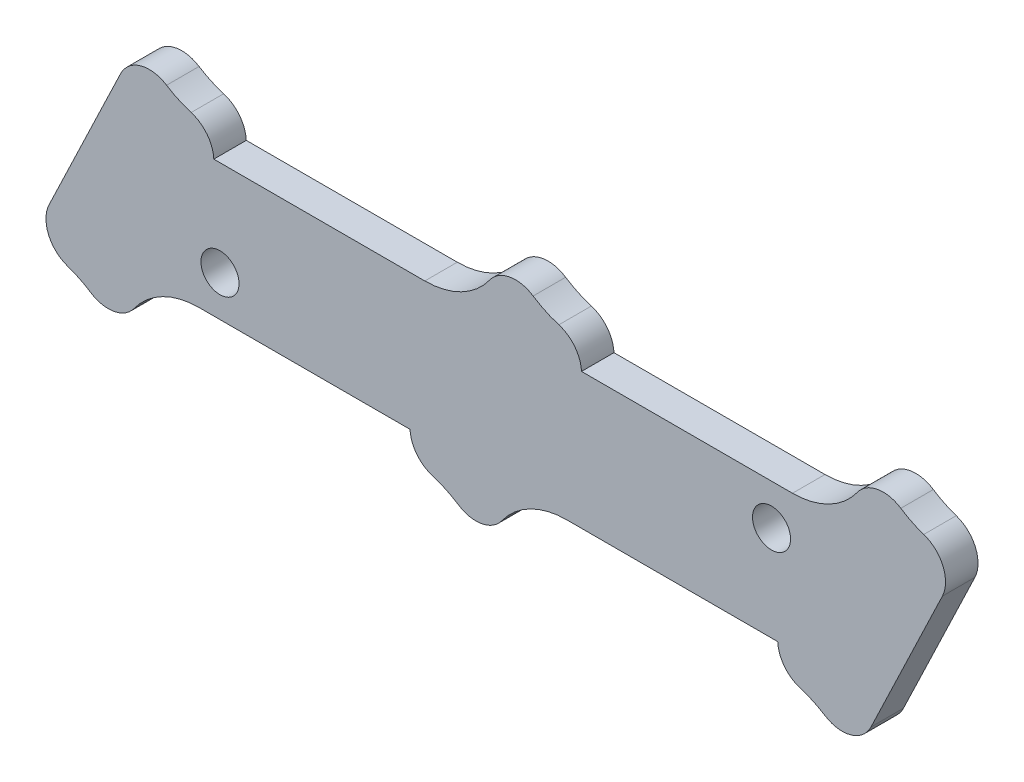
ISO-10303-21;
HEADER;
FILE_DESCRIPTION(('STEP AP214'),'2;1');
FILE_NAME('part.step','',(''),(''),'','','');
FILE_SCHEMA(('AUTOMOTIVE_DESIGN { 1 0 10303 214 1 1 1 1 }'));
ENDSEC;
DATA;
#1=APPLICATION_CONTEXT('core data for automotive mechanical design processes');
#2=APPLICATION_PROTOCOL_DEFINITION('international standard','automotive_design',2000,#1);
#3=PRODUCT_CONTEXT('',#1,'mechanical');
#4=PRODUCT('Part','Part','',(#3));
#5=PRODUCT_RELATED_PRODUCT_CATEGORY('part','',(#4));
#6=PRODUCT_DEFINITION_FORMATION('','',#4);
#7=PRODUCT_DEFINITION_CONTEXT('part definition',#1,'design');
#8=PRODUCT_DEFINITION('design','',#6,#7);
#9=PRODUCT_DEFINITION_SHAPE('','',#8);
#10=(LENGTH_UNIT() NAMED_UNIT(*) SI_UNIT(.MILLI.,.METRE.));
#11=(NAMED_UNIT(*) PLANE_ANGLE_UNIT() SI_UNIT($,.RADIAN.));
#12=(NAMED_UNIT(*) SI_UNIT($,.STERADIAN.) SOLID_ANGLE_UNIT());
#13=UNCERTAINTY_MEASURE_WITH_UNIT(LENGTH_MEASURE(1.E-05),#10,'distance_accuracy_value','');
#14=(GEOMETRIC_REPRESENTATION_CONTEXT(3) GLOBAL_UNCERTAINTY_ASSIGNED_CONTEXT((#13)) GLOBAL_UNIT_ASSIGNED_CONTEXT((#10,
#11,#12)) REPRESENTATION_CONTEXT('',''));
#15=CARTESIAN_POINT('',(0.,0.,0.));
#16=DIRECTION('',(0.,0.,1.));
#17=DIRECTION('',(1.,0.,0.));
#18=AXIS2_PLACEMENT_3D('',#15,#16,#17);
#19=CARTESIAN_POINT('',(10.775,10.775,2.032));
#20=DIRECTION('',(0.,0.,-1.));
#21=DIRECTION('',(-1.,0.,0.));
#22=AXIS2_PLACEMENT_3D('',#19,#20,#21);
#23=CYLINDRICAL_SURFACE('',#22,6.2);
#24=CARTESIAN_POINT('',(10.775,10.775,0.));
#25=DIRECTION('',(0.,0.,1.));
#26=DIRECTION('',(1.,0.,0.));
#27=AXIS2_PLACEMENT_3D('',#24,#25,#26);
#28=CIRCLE('',#27,6.2);
#29=CARTESIAN_POINT('',(14.1869891683855,15.9517103371562,0.));
#30=VERTEX_POINT('',#29);
#31=CARTESIAN_POINT('',(12.7522873345002,16.6512517642478,0.));
#32=VERTEX_POINT('',#31);
#33=EDGE_CURVE('E631',#30,#32,#28,.T.);
#34=ORIENTED_EDGE('',*,*,#33,.F.);
#35=DIRECTION('',(0.,0.,-1.));
#36=VECTOR('',#35,1.);
#37=CARTESIAN_POINT('',(14.1869891683855,15.9517103371562,2.032));
#38=LINE('',#37,#36);
#39=CARTESIAN_POINT('',(14.1869891683855,15.9517103371562,2.032));
#40=VERTEX_POINT('',#39);
#41=EDGE_CURVE('E306',#30,#40,#38,.F.);
#42=ORIENTED_EDGE('',*,*,#41,.T.);
#43=CARTESIAN_POINT('',(10.775,10.775,2.032));
#44=DIRECTION('',(0.,0.,1.));
#45=DIRECTION('',(1.,0.,0.));
#46=AXIS2_PLACEMENT_3D('',#43,#44,#45);
#47=CIRCLE('',#46,6.2);
#48=CARTESIAN_POINT('',(12.7522873345002,16.6512517642478,2.032));
#49=VERTEX_POINT('',#48);
#50=EDGE_CURVE('E244',#40,#49,#47,.T.);
#51=ORIENTED_EDGE('',*,*,#50,.T.);
#52=DIRECTION('',(0.,0.,-1.));
#53=VECTOR('',#52,1.);
#54=CARTESIAN_POINT('',(12.7522873345002,16.6512517642478,2.032));
#55=LINE('',#54,#53);
#56=EDGE_CURVE('E303',#49,#32,#55,.T.);
#57=ORIENTED_EDGE('',*,*,#56,.T.);
#58=EDGE_LOOP('',(#34,#42,#51,#57));
#59=FACE_BOUND('',#58,.T.);
#60=ADVANCED_FACE('F45',(#59),#23,.F.);
#61=CARTESIAN_POINT('',(0.,18.525,2.032));
#62=DIRECTION('',(0.,1.,0.));
#63=DIRECTION('',(0.,0.,1.));
#64=AXIS2_PLACEMENT_3D('',#61,#62,#63);
#65=PLANE('',#64);
#66=DIRECTION('',(1.,0.,0.));
#67=VECTOR('',#66,1.);
#68=CARTESIAN_POINT('',(0.,18.525,2.032));
#69=LINE('',#68,#67);
#70=CARTESIAN_POINT('',(20.9636972547808,18.525,2.032));
#71=VERTEX_POINT('',#70);
#72=CARTESIAN_POINT('',(34.1619208211239,18.525,2.032));
#73=VERTEX_POINT('',#72);
#74=EDGE_CURVE('E230',#71,#73,#69,.T.);
#75=ORIENTED_EDGE('',*,*,#74,.F.);
#76=DIRECTION('',(0.,0.,-1.));
#77=VECTOR('',#76,1.);
#78=CARTESIAN_POINT('',(20.9636972547808,18.525,0.));
#79=LINE('',#78,#77);
#80=CARTESIAN_POINT('',(20.9636972547808,18.525,0.));
#81=VERTEX_POINT('',#80);
#82=EDGE_CURVE('E345',#71,#81,#79,.T.);
#83=ORIENTED_EDGE('',*,*,#82,.T.);
#84=DIRECTION('',(1.,0.,0.));
#85=VECTOR('',#84,1.);
#86=CARTESIAN_POINT('',(0.,18.525,0.));
#87=LINE('',#86,#85);
#88=CARTESIAN_POINT('',(34.1619208211239,18.525,0.));
#89=VERTEX_POINT('',#88);
#90=EDGE_CURVE('E251',#81,#89,#87,.T.);
#91=ORIENTED_EDGE('',*,*,#90,.T.);
#92=DIRECTION('',(0.,0.,-1.));
#93=VECTOR('',#92,1.);
#94=CARTESIAN_POINT('',(34.1619208211239,18.525,2.032));
#95=LINE('',#94,#93);
#96=EDGE_CURVE('E248',#73,#89,#95,.T.);
#97=ORIENTED_EDGE('',*,*,#96,.F.);
#98=EDGE_LOOP('',(#75,#83,#91,#97));
#99=FACE_BOUND('',#98,.T.);
#100=ADVANCED_FACE('F249',(#99),#65,.F.);
#101=CARTESIAN_POINT('',(33.775,10.775,2.032));
#102=DIRECTION('',(0.,0.,-1.));
#103=DIRECTION('',(-1.,0.,0.));
#104=AXIS2_PLACEMENT_3D('',#101,#102,#103);
#105=CYLINDRICAL_SURFACE('',#104,6.2);
#106=CARTESIAN_POINT('',(33.775,10.775,2.032));
#107=DIRECTION('',(0.,0.,1.));
#108=DIRECTION('',(1.,0.,0.));
#109=AXIS2_PLACEMENT_3D('',#106,#107,#108);
#110=CIRCLE('',#109,6.2);
#111=CARTESIAN_POINT('',(37.1869891683854,15.9517103371562,2.032));
#112=VERTEX_POINT('',#111);
#113=CARTESIAN_POINT('',(35.5780162784352,16.7070428437173,2.032));
#114=VERTEX_POINT('',#113);
#115=EDGE_CURVE('E243',#112,#114,#110,.T.);
#116=ORIENTED_EDGE('',*,*,#115,.T.);
#117=DIRECTION('',(0.,0.,-1.));
#118=VECTOR('',#117,1.);
#119=CARTESIAN_POINT('',(35.5780162784352,16.7070428437173,2.032));
#120=LINE('',#119,#118);
#121=CARTESIAN_POINT('',(35.5780162784352,16.7070428437173,0.));
#122=VERTEX_POINT('',#121);
#123=EDGE_CURVE('E259',#114,#122,#120,.T.);
#124=ORIENTED_EDGE('',*,*,#123,.T.);
#125=CARTESIAN_POINT('',(33.775,10.775,0.));
#126=DIRECTION('',(0.,0.,1.));
#127=DIRECTION('',(1.,0.,0.));
#128=AXIS2_PLACEMENT_3D('',#125,#126,#127);
#129=CIRCLE('',#128,6.2);
#130=CARTESIAN_POINT('',(37.1869891683854,15.9517103371562,0.));
#131=VERTEX_POINT('',#130);
#132=EDGE_CURVE('E397',#131,#122,#129,.T.);
#133=ORIENTED_EDGE('',*,*,#132,.F.);
#134=DIRECTION('',(0.,0.,-1.));
#135=VECTOR('',#134,1.);
#136=CARTESIAN_POINT('',(37.1869891683854,15.9517103371562,2.032));
#137=LINE('',#136,#135);
#138=EDGE_CURVE('E294',#131,#112,#137,.F.);
#139=ORIENTED_EDGE('',*,*,#138,.T.);
#140=EDGE_LOOP('',(#116,#124,#133,#139));
#141=FACE_BOUND('',#140,.T.);
#142=ADVANCED_FACE('F476',(#141),#105,.F.);
#143=CARTESIAN_POINT('',(0.,18.525,2.032));
#144=DIRECTION('',(0.,1.,0.));
#145=DIRECTION('',(0.,0.,1.));
#146=AXIS2_PLACEMENT_3D('',#143,#144,#145);
#147=PLANE('',#146);
#148=DIRECTION('',(1.,0.,0.));
#149=VECTOR('',#148,1.);
#150=CARTESIAN_POINT('',(0.,18.525,2.032));
#151=LINE('',#150,#149);
#152=CARTESIAN_POINT('',(43.9636972547808,18.525,2.032));
#153=VERTEX_POINT('',#152);
#154=CARTESIAN_POINT('',(57.1619208211239,18.525,2.032));
#155=VERTEX_POINT('',#154);
#156=EDGE_CURVE('E611',#153,#155,#151,.T.);
#157=ORIENTED_EDGE('',*,*,#156,.F.);
#158=DIRECTION('',(0.,0.,-1.));
#159=VECTOR('',#158,1.);
#160=CARTESIAN_POINT('',(43.9636972547808,18.525,0.));
#161=LINE('',#160,#159);
#162=CARTESIAN_POINT('',(43.9636972547808,18.525,0.));
#163=VERTEX_POINT('',#162);
#164=EDGE_CURVE('E429',#153,#163,#161,.T.);
#165=ORIENTED_EDGE('',*,*,#164,.T.);
#166=DIRECTION('',(1.,0.,0.));
#167=VECTOR('',#166,1.);
#168=CARTESIAN_POINT('',(0.,18.525,0.));
#169=LINE('',#168,#167);
#170=CARTESIAN_POINT('',(57.1619208211239,18.525,0.));
#171=VERTEX_POINT('',#170);
#172=EDGE_CURVE('E392',#163,#171,#169,.T.);
#173=ORIENTED_EDGE('',*,*,#172,.T.);
#174=DIRECTION('',(0.,0.,-1.));
#175=VECTOR('',#174,1.);
#176=CARTESIAN_POINT('',(57.1619208211239,18.525,2.032));
#177=LINE('',#176,#175);
#178=EDGE_CURVE('E254',#155,#171,#177,.T.);
#179=ORIENTED_EDGE('',*,*,#178,.F.);
#180=EDGE_LOOP('',(#157,#165,#173,#179));
#181=FACE_BOUND('',#180,.T.);
#182=ADVANCED_FACE('F600',(#181),#147,.F.);
#183=CARTESIAN_POINT('',(56.775,10.775,2.032));
#184=DIRECTION('',(0.,0.,-1.));
#185=DIRECTION('',(-1.,0.,0.));
#186=AXIS2_PLACEMENT_3D('',#183,#184,#185);
#187=CYLINDRICAL_SURFACE('',#186,6.2);
#188=CARTESIAN_POINT('',(56.775,10.775,0.));
#189=DIRECTION('',(0.,0.,1.));
#190=DIRECTION('',(1.,0.,0.));
#191=AXIS2_PLACEMENT_3D('',#188,#189,#190);
#192=CIRCLE('',#191,6.2);
#193=CARTESIAN_POINT('',(60.116009134035,15.997801735304,0.));
#194=VERTEX_POINT('',#193);
#195=CARTESIAN_POINT('',(58.5780162784352,16.7070428437173,0.));
#196=VERTEX_POINT('',#195);
#197=EDGE_CURVE('E382',#194,#196,#192,.T.);
#198=ORIENTED_EDGE('',*,*,#197,.F.);
#199=DIRECTION('',(0.,0.,-1.));
#200=VECTOR('',#199,1.);
#201=CARTESIAN_POINT('',(60.116009134035,15.997801735304,2.032));
#202=LINE('',#201,#200);
#203=CARTESIAN_POINT('',(60.116009134035,15.997801735304,2.032));
#204=VERTEX_POINT('',#203);
#205=EDGE_CURVE('E328',#194,#204,#202,.F.);
#206=ORIENTED_EDGE('',*,*,#205,.T.);
#207=CARTESIAN_POINT('',(56.775,10.775,2.032));
#208=DIRECTION('',(0.,0.,1.));
#209=DIRECTION('',(1.,0.,0.));
#210=AXIS2_PLACEMENT_3D('',#207,#208,#209);
#211=CIRCLE('',#210,6.2);
#212=CARTESIAN_POINT('',(58.5780162784352,16.7070428437173,2.032));
#213=VERTEX_POINT('',#212);
#214=EDGE_CURVE('E384',#204,#213,#211,.T.);
#215=ORIENTED_EDGE('',*,*,#214,.T.);
#216=DIRECTION('',(0.,0.,-1.));
#217=VECTOR('',#216,1.);
#218=CARTESIAN_POINT('',(58.5780162784352,16.7070428437173,2.032));
#219=LINE('',#218,#217);
#220=EDGE_CURVE('E332',#213,#196,#219,.T.);
#221=ORIENTED_EDGE('',*,*,#220,.T.);
#222=EDGE_LOOP('',(#198,#206,#215,#221));
#223=FACE_BOUND('',#222,.T.);
#224=ADVANCED_FACE('F381',(#223),#187,.F.);
#225=CARTESIAN_POINT('',(44.6800333314969,-21.4091826380089,2.032));
#226=DIRECTION('',(-0.901816028724632,0.432120180430553,0.));
#227=DIRECTION('',(-0.432120180430553,-0.901816028724632,0.));
#228=AXIS2_PLACEMENT_3D('',#225,#226,#227);
#229=PLANE('',#228);
#230=DIRECTION('',(0.432120180430553,0.901816028724632,0.));
#231=VECTOR('',#230,1.);
#232=CARTESIAN_POINT('',(44.6800333314969,-21.4091826380089,2.032));
#233=LINE('',#232,#231);
#234=CARTESIAN_POINT('',(62.9973860734311,16.8183361277668,2.032));
#235=VERTEX_POINT('',#234);
#236=CARTESIAN_POINT('',(67.4635100989167,26.1389427896499,2.032));
#237=VERTEX_POINT('',#236);
#238=EDGE_CURVE('E617',#235,#237,#233,.T.);
#239=ORIENTED_EDGE('',*,*,#238,.F.);
#240=DIRECTION('',(0.,0.,1.));
#241=VECTOR('',#240,1.);
#242=CARTESIAN_POINT('',(62.9973860734311,16.8183361277668,0.));
#243=LINE('',#242,#241);
#244=CARTESIAN_POINT('',(62.9973860734311,16.8183361277668,0.));
#245=VERTEX_POINT('',#244);
#246=EDGE_CURVE('E450',#235,#245,#243,.F.);
#247=ORIENTED_EDGE('',*,*,#246,.T.);
#248=DIRECTION('',(0.432120180430553,0.901816028724632,0.));
#249=VECTOR('',#248,1.);
#250=CARTESIAN_POINT('',(44.6800333314969,-21.4091826380089,0.));
#251=LINE('',#250,#249);
#252=CARTESIAN_POINT('',(67.4635100989167,26.1389427896499,0.));
#253=VERTEX_POINT('',#252);
#254=EDGE_CURVE('E391',#245,#253,#251,.T.);
#255=ORIENTED_EDGE('',*,*,#254,.T.);
#256=DIRECTION('',(0.,0.,1.));
#257=VECTOR('',#256,1.);
#258=CARTESIAN_POINT('',(67.4635100989167,26.1389427896499,2.032));
#259=LINE('',#258,#257);
#260=EDGE_CURVE('E346',#253,#237,#259,.T.);
#261=ORIENTED_EDGE('',*,*,#260,.T.);
#262=EDGE_LOOP('',(#239,#247,#255,#261));
#263=FACE_BOUND('',#262,.T.);
#264=ADVANCED_FACE('F593',(#263),#229,.F.);
#265=CARTESIAN_POINT('',(68.275,34.775,2.032));
#266=DIRECTION('',(0.,0.,-1.));
#267=DIRECTION('',(-1.,0.,0.));
#268=AXIS2_PLACEMENT_3D('',#265,#266,#267);
#269=CYLINDRICAL_SURFACE('',#268,6.2);
#270=CARTESIAN_POINT('',(68.275,34.775,2.032));
#271=DIRECTION('',(0.,0.,1.));
#272=DIRECTION('',(1.,0.,0.));
#273=AXIS2_PLACEMENT_3D('',#270,#271,#272);
#274=CIRCLE('',#273,6.2);
#275=CARTESIAN_POINT('',(64.8630108316146,29.5982896628437,2.032));
#276=VERTEX_POINT('',#275);
#277=CARTESIAN_POINT('',(66.2977126654998,28.8987482357522,2.032));
#278=VERTEX_POINT('',#277);
#279=EDGE_CURVE('E620',#276,#278,#274,.T.);
#280=ORIENTED_EDGE('',*,*,#279,.T.);
#281=DIRECTION('',(0.,0.,-1.));
#282=VECTOR('',#281,1.);
#283=CARTESIAN_POINT('',(66.2977126654998,28.8987482357522,2.032));
#284=LINE('',#283,#282);
#285=CARTESIAN_POINT('',(66.2977126654998,28.8987482357522,0.));
#286=VERTEX_POINT('',#285);
#287=EDGE_CURVE('E280',#278,#286,#284,.T.);
#288=ORIENTED_EDGE('',*,*,#287,.T.);
#289=CARTESIAN_POINT('',(68.275,34.775,0.));
#290=DIRECTION('',(0.,0.,1.));
#291=DIRECTION('',(1.,0.,0.));
#292=AXIS2_PLACEMENT_3D('',#289,#290,#291);
#293=CIRCLE('',#292,6.2);
#294=CARTESIAN_POINT('',(64.8630108316146,29.5982896628437,0.));
#295=VERTEX_POINT('',#294);
#296=EDGE_CURVE('E395',#295,#286,#293,.T.);
#297=ORIENTED_EDGE('',*,*,#296,.F.);
#298=DIRECTION('',(0.,0.,-1.));
#299=VECTOR('',#298,1.);
#300=CARTESIAN_POINT('',(64.8630108316146,29.5982896628437,2.032));
#301=LINE('',#300,#299);
#302=EDGE_CURVE('E278',#295,#276,#301,.F.);
#303=ORIENTED_EDGE('',*,*,#302,.T.);
#304=EDGE_LOOP('',(#280,#288,#297,#303));
#305=FACE_BOUND('',#304,.T.);
#306=ADVANCED_FACE('F589',(#305),#269,.F.);
#307=CARTESIAN_POINT('',(0.,27.025,2.032));
#308=DIRECTION('',(0.,1.,0.));
#309=DIRECTION('',(0.,0.,1.));
#310=AXIS2_PLACEMENT_3D('',#307,#308,#309);
#311=PLANE('',#310);
#312=DIRECTION('',(1.,0.,0.));
#313=VECTOR('',#312,1.);
#314=CARTESIAN_POINT('',(0.,27.025,2.032));
#315=LINE('',#314,#313);
#316=CARTESIAN_POINT('',(44.8880791788761,27.025,2.032));
#317=VERTEX_POINT('',#316);
#318=CARTESIAN_POINT('',(58.0863027452192,27.025,2.032));
#319=VERTEX_POINT('',#318);
#320=EDGE_CURVE('E623',#317,#319,#315,.T.);
#321=ORIENTED_EDGE('',*,*,#320,.T.);
#322=DIRECTION('',(0.,0.,-1.));
#323=VECTOR('',#322,1.);
#324=CARTESIAN_POINT('',(58.0863027452192,27.025,0.));
#325=LINE('',#324,#323);
#326=CARTESIAN_POINT('',(58.0863027452192,27.025,0.));
#327=VERTEX_POINT('',#326);
#328=EDGE_CURVE('E253',#319,#327,#325,.T.);
#329=ORIENTED_EDGE('',*,*,#328,.T.);
#330=DIRECTION('',(1.,0.,0.));
#331=VECTOR('',#330,1.);
#332=CARTESIAN_POINT('',(0.,27.025,0.));
#333=LINE('',#332,#331);
#334=CARTESIAN_POINT('',(44.8880791788761,27.025,0.));
#335=VERTEX_POINT('',#334);
#336=EDGE_CURVE('E403',#335,#327,#333,.T.);
#337=ORIENTED_EDGE('',*,*,#336,.F.);
#338=DIRECTION('',(0.,0.,-1.));
#339=VECTOR('',#338,1.);
#340=CARTESIAN_POINT('',(44.8880791788761,27.025,2.032));
#341=LINE('',#340,#339);
#342=EDGE_CURVE('E419',#317,#335,#341,.T.);
#343=ORIENTED_EDGE('',*,*,#342,.F.);
#344=EDGE_LOOP('',(#321,#329,#337,#343));
#345=FACE_BOUND('',#344,.T.);
#346=ADVANCED_FACE('F585',(#345),#311,.T.);
#347=CARTESIAN_POINT('',(45.275,34.775,2.032));
#348=DIRECTION('',(0.,0.,-1.));
#349=DIRECTION('',(-1.,0.,0.));
#350=AXIS2_PLACEMENT_3D('',#347,#348,#349);
#351=CYLINDRICAL_SURFACE('',#350,6.2);
#352=CARTESIAN_POINT('',(45.275,34.775,2.032));
#353=DIRECTION('',(0.,0.,1.));
#354=DIRECTION('',(1.,0.,0.));
#355=AXIS2_PLACEMENT_3D('',#352,#353,#354);
#356=CIRCLE('',#355,6.2);
#357=CARTESIAN_POINT('',(41.8630108316145,29.5982896628438,2.032));
#358=VERTEX_POINT('',#357);
#359=CARTESIAN_POINT('',(43.4719837215648,28.8429571562827,2.032));
#360=VERTEX_POINT('',#359);
#361=EDGE_CURVE('E626',#358,#360,#356,.T.);
#362=ORIENTED_EDGE('',*,*,#361,.T.);
#363=DIRECTION('',(0.,0.,-1.));
#364=VECTOR('',#363,1.);
#365=CARTESIAN_POINT('',(43.4719837215648,28.8429571562827,2.032));
#366=LINE('',#365,#364);
#367=CARTESIAN_POINT('',(43.4719837215648,28.8429571562827,0.));
#368=VERTEX_POINT('',#367);
#369=EDGE_CURVE('E288',#360,#368,#366,.T.);
#370=ORIENTED_EDGE('',*,*,#369,.T.);
#371=CARTESIAN_POINT('',(45.275,34.775,0.));
#372=DIRECTION('',(0.,0.,1.));
#373=DIRECTION('',(1.,0.,0.));
#374=AXIS2_PLACEMENT_3D('',#371,#372,#373);
#375=CIRCLE('',#374,6.2);
#376=CARTESIAN_POINT('',(41.8630108316145,29.5982896628438,0.));
#377=VERTEX_POINT('',#376);
#378=EDGE_CURVE('E406',#377,#368,#375,.T.);
#379=ORIENTED_EDGE('',*,*,#378,.F.);
#380=DIRECTION('',(0.,0.,-1.));
#381=VECTOR('',#380,1.);
#382=CARTESIAN_POINT('',(41.8630108316145,29.5982896628438,2.032));
#383=LINE('',#382,#381);
#384=EDGE_CURVE('E286',#377,#358,#383,.F.);
#385=ORIENTED_EDGE('',*,*,#384,.T.);
#386=EDGE_LOOP('',(#362,#370,#379,#385));
#387=FACE_BOUND('',#386,.T.);
#388=ADVANCED_FACE('F582',(#387),#351,.F.);
#389=CARTESIAN_POINT('',(0.,27.025,2.032));
#390=DIRECTION('',(0.,1.,0.));
#391=DIRECTION('',(0.,0.,1.));
#392=AXIS2_PLACEMENT_3D('',#389,#390,#391);
#393=PLANE('',#392);
#394=DIRECTION('',(1.,0.,0.));
#395=VECTOR('',#394,1.);
#396=CARTESIAN_POINT('',(0.,27.025,2.032));
#397=LINE('',#396,#395);
#398=CARTESIAN_POINT('',(21.8880791788762,27.025,2.032));
#399=VERTEX_POINT('',#398);
#400=CARTESIAN_POINT('',(35.0863027452192,27.025,2.032));
#401=VERTEX_POINT('',#400);
#402=EDGE_CURVE('E325',#399,#401,#397,.T.);
#403=ORIENTED_EDGE('',*,*,#402,.T.);
#404=DIRECTION('',(0.,0.,-1.));
#405=VECTOR('',#404,1.);
#406=CARTESIAN_POINT('',(35.0863027452192,27.025,0.));
#407=LINE('',#406,#405);
#408=CARTESIAN_POINT('',(35.0863027452192,27.025,0.));
#409=VERTEX_POINT('',#408);
#410=EDGE_CURVE('E426',#401,#409,#407,.T.);
#411=ORIENTED_EDGE('',*,*,#410,.T.);
#412=DIRECTION('',(1.,0.,0.));
#413=VECTOR('',#412,1.);
#414=CARTESIAN_POINT('',(0.,27.025,0.));
#415=LINE('',#414,#413);
#416=CARTESIAN_POINT('',(21.8880791788762,27.025,0.));
#417=VERTEX_POINT('',#416);
#418=EDGE_CURVE('E409',#417,#409,#415,.T.);
#419=ORIENTED_EDGE('',*,*,#418,.F.);
#420=DIRECTION('',(0.,0.,-1.));
#421=VECTOR('',#420,1.);
#422=CARTESIAN_POINT('',(21.8880791788762,27.025,2.032));
#423=LINE('',#422,#421);
#424=EDGE_CURVE('E416',#399,#417,#423,.T.);
#425=ORIENTED_EDGE('',*,*,#424,.F.);
#426=EDGE_LOOP('',(#403,#411,#419,#425));
#427=FACE_BOUND('',#426,.T.);
#428=ADVANCED_FACE('F458',(#427),#393,.T.);
#429=CARTESIAN_POINT('',(22.275,34.775,2.032));
#430=DIRECTION('',(0.,0.,-1.));
#431=DIRECTION('',(-1.,0.,0.));
#432=AXIS2_PLACEMENT_3D('',#429,#430,#431);
#433=CYLINDRICAL_SURFACE('',#432,6.2);
#434=CARTESIAN_POINT('',(22.275,34.775,2.032));
#435=DIRECTION('',(0.,0.,1.));
#436=DIRECTION('',(1.,0.,0.));
#437=AXIS2_PLACEMENT_3D('',#434,#435,#436);
#438=CIRCLE('',#437,6.2);
#439=CARTESIAN_POINT('',(18.933990865965,29.552198264696,2.032));
#440=VERTEX_POINT('',#439);
#441=CARTESIAN_POINT('',(20.4719837215648,28.8429571562827,2.032));
#442=VERTEX_POINT('',#441);
#443=EDGE_CURVE('E316',#440,#442,#438,.T.);
#444=ORIENTED_EDGE('',*,*,#443,.T.);
#445=DIRECTION('',(0.,0.,-1.));
#446=VECTOR('',#445,1.);
#447=CARTESIAN_POINT('',(20.4719837215648,28.8429571562827,2.032));
#448=LINE('',#447,#446);
#449=CARTESIAN_POINT('',(20.4719837215648,28.8429571562827,0.));
#450=VERTEX_POINT('',#449);
#451=EDGE_CURVE('E11',#442,#450,#448,.T.);
#452=ORIENTED_EDGE('',*,*,#451,.T.);
#453=CARTESIAN_POINT('',(22.275,34.775,0.));
#454=DIRECTION('',(0.,0.,1.));
#455=DIRECTION('',(1.,0.,0.));
#456=AXIS2_PLACEMENT_3D('',#453,#454,#455);
#457=CIRCLE('',#456,6.2);
#458=CARTESIAN_POINT('',(18.933990865965,29.552198264696,0.));
#459=VERTEX_POINT('',#458);
#460=EDGE_CURVE('E319',#459,#450,#457,.T.);
#461=ORIENTED_EDGE('',*,*,#460,.F.);
#462=DIRECTION('',(0.,0.,-1.));
#463=VECTOR('',#462,1.);
#464=CARTESIAN_POINT('',(18.933990865965,29.552198264696,2.032));
#465=LINE('',#464,#463);
#466=EDGE_CURVE('E53',#459,#440,#465,.F.);
#467=ORIENTED_EDGE('',*,*,#466,.T.);
#468=EDGE_LOOP('',(#444,#452,#461,#467));
#469=FACE_BOUND('',#468,.T.);
#470=ADVANCED_FACE('F315',(#469),#433,.F.);
#471=CARTESIAN_POINT('',(1.85861827457443,-0.890587923233582,2.032));
#472=DIRECTION('',(-0.901816028724632,0.432120180430553,0.));
#473=DIRECTION('',(-0.432120180430553,-0.901816028724632,0.));
#474=AXIS2_PLACEMENT_3D('',#471,#472,#473);
#475=PLANE('',#474);
#476=DIRECTION('',(0.432120180430553,0.901816028724632,0.));
#477=VECTOR('',#476,1.);
#478=CARTESIAN_POINT('',(1.85861827457443,-0.890587923233582,0.));
#479=LINE('',#478,#477);
#480=CARTESIAN_POINT('',(11.5864899010833,19.4110572103501,0.));
#481=VERTEX_POINT('',#480);
#482=CARTESIAN_POINT('',(16.0526139265689,28.7316638722332,0.));
#483=VERTEX_POINT('',#482);
#484=EDGE_CURVE('E413',#481,#483,#479,.T.);
#485=ORIENTED_EDGE('',*,*,#484,.F.);
#486=DIRECTION('',(0.,0.,-1.));
#487=VECTOR('',#486,1.);
#488=CARTESIAN_POINT('',(11.5864899010833,19.4110572103501,2.032));
#489=LINE('',#488,#487);
#490=CARTESIAN_POINT('',(11.5864899010833,19.4110572103501,2.032));
#491=VERTEX_POINT('',#490);
#492=EDGE_CURVE('E67',#481,#491,#489,.F.);
#493=ORIENTED_EDGE('',*,*,#492,.T.);
#494=DIRECTION('',(0.432120180430553,0.901816028724632,0.));
#495=VECTOR('',#494,1.);
#496=CARTESIAN_POINT('',(1.85861827457443,-0.890587923233582,2.032));
#497=LINE('',#496,#495);
#498=CARTESIAN_POINT('',(16.0526139265689,28.7316638722332,2.032));
#499=VERTEX_POINT('',#498);
#500=EDGE_CURVE('E324',#491,#499,#497,.T.);
#501=ORIENTED_EDGE('',*,*,#500,.T.);
#502=DIRECTION('',(0.,0.,-1.));
#503=VECTOR('',#502,1.);
#504=CARTESIAN_POINT('',(16.0526139265689,28.7316638722332,2.032));
#505=LINE('',#504,#503);
#506=EDGE_CURVE('E308',#499,#483,#505,.T.);
#507=ORIENTED_EDGE('',*,*,#506,.T.);
#508=EDGE_LOOP('',(#485,#493,#501,#507));
#509=FACE_BOUND('',#508,.T.);
#510=ADVANCED_FACE('F572',(#509),#475,.T.);
#511=CARTESIAN_POINT('',(0.,0.,2.032));
#512=DIRECTION('',(0.,0.,1.));
#513=DIRECTION('',(1.,0.,0.));
#514=AXIS2_PLACEMENT_3D('',#511,#512,#513);
#515=PLANE('',#514);
#516=CARTESIAN_POINT('',(22.274999999999,21.065,2.032));
#517=DIRECTION('',(0.,0.,1.));
#518=DIRECTION('',(1.,0.,0.));
#519=AXIS2_PLACEMENT_3D('',#516,#517,#518);
#520=CIRCLE('',#519,1.190625);
#521=CARTESIAN_POINT('',(23.465624999999,21.065,2.032));
#522=VERTEX_POINT('',#521);
#523=EDGE_CURVE('E663',#522,#522,#520,.T.);
#524=ORIENTED_EDGE('',*,*,#523,.F.);
#525=EDGE_LOOP('',(#524));
#526=FACE_BOUND('',#525,.T.);
#527=CARTESIAN_POINT('',(56.7749999999996,24.485,2.032));
#528=DIRECTION('',(0.,0.,1.));
#529=DIRECTION('',(1.,0.,0.));
#530=AXIS2_PLACEMENT_3D('',#527,#528,#529);
#531=CIRCLE('',#530,1.190625);
#532=CARTESIAN_POINT('',(57.9656249999996,24.485,2.032));
#533=VERTEX_POINT('',#532);
#534=EDGE_CURVE('E671',#533,#533,#531,.T.);
#535=ORIENTED_EDGE('',*,*,#534,.F.);
#536=EDGE_LOOP('',(#535));
#537=FACE_BOUND('',#536,.T.);
#538=ORIENTED_EDGE('',*,*,#214,.F.);
#539=CARTESIAN_POINT('',(61.1937540159818,17.6825764886279,2.032));
#540=DIRECTION('',(0.,0.,1.));
#541=DIRECTION('',(1.,0.,0.));
#542=AXIS2_PLACEMENT_3D('',#539,#540,#541);
#543=CIRCLE('',#542,2.);
#544=EDGE_CURVE('E276',#204,#235,#543,.T.);
#545=ORIENTED_EDGE('',*,*,#544,.T.);
#546=ORIENTED_EDGE('',*,*,#238,.T.);
#547=CARTESIAN_POINT('',(65.6598780414675,27.003183150511,2.032));
#548=DIRECTION('',(0.,0.,1.));
#549=DIRECTION('',(1.,0.,0.));
#550=AXIS2_PLACEMENT_3D('',#547,#548,#549);
#551=CIRCLE('',#550,2.);
#552=EDGE_CURVE('E272',#237,#278,#551,.T.);
#553=ORIENTED_EDGE('',*,*,#552,.T.);
#554=ORIENTED_EDGE('',*,*,#279,.F.);
#555=CARTESIAN_POINT('',(63.7623691643934,27.9283831024708,2.032));
#556=DIRECTION('',(0.,0.,1.));
#557=DIRECTION('',(1.,0.,0.));
#558=AXIS2_PLACEMENT_3D('',#555,#556,#557);
#559=CIRCLE('',#558,2.);
#560=CARTESIAN_POINT('',(62.1406359017722,29.0988450731934,2.032));
#561=VERTEX_POINT('',#560);
#562=EDGE_CURVE('E270',#276,#561,#559,.T.);
#563=ORIENTED_EDGE('',*,*,#562,.T.);
#564=CARTESIAN_POINT('',(58.0863027452192,32.025,2.032));
#565=DIRECTION('',(0.,0.,1.));
#566=DIRECTION('',(1.,0.,0.));
#567=AXIS2_PLACEMENT_3D('',#564,#565,#566);
#568=CIRCLE('',#567,5.);
#569=EDGE_CURVE('E436',#561,#319,#568,.F.);
#570=ORIENTED_EDGE('',*,*,#569,.T.);
#571=ORIENTED_EDGE('',*,*,#320,.F.);
#572=CARTESIAN_POINT('',(42.8903655672308,26.929394948632,2.032));
#573=DIRECTION('',(0.,0.,1.));
#574=DIRECTION('',(1.,0.,0.));
#575=AXIS2_PLACEMENT_3D('',#572,#573,#574);
#576=CIRCLE('',#575,2.);
#577=EDGE_CURVE('E263',#317,#360,#576,.T.);
#578=ORIENTED_EDGE('',*,*,#577,.T.);
#579=ORIENTED_EDGE('',*,*,#361,.F.);
#580=CARTESIAN_POINT('',(40.7623691643934,27.9283831024708,2.032));
#581=DIRECTION('',(0.,0.,1.));
#582=DIRECTION('',(1.,0.,0.));
#583=AXIS2_PLACEMENT_3D('',#580,#581,#582);
#584=CIRCLE('',#583,2.);
#585=CARTESIAN_POINT('',(39.1406359017722,29.0988450731934,2.032));
#586=VERTEX_POINT('',#585);
#587=EDGE_CURVE('E260',#358,#586,#584,.T.);
#588=ORIENTED_EDGE('',*,*,#587,.T.);
#589=CARTESIAN_POINT('',(35.0863027452192,32.025,2.032));
#590=DIRECTION('',(0.,0.,1.));
#591=DIRECTION('',(1.,0.,0.));
#592=AXIS2_PLACEMENT_3D('',#589,#590,#591);
#593=CIRCLE('',#592,5.);
#594=EDGE_CURVE('E441',#586,#401,#593,.F.);
#595=ORIENTED_EDGE('',*,*,#594,.T.);
#596=ORIENTED_EDGE('',*,*,#402,.F.);
#597=CARTESIAN_POINT('',(19.8903655672308,26.929394948632,2.032));
#598=DIRECTION('',(0.,0.,1.));
#599=DIRECTION('',(1.,0.,0.));
#600=AXIS2_PLACEMENT_3D('',#597,#598,#599);
#601=CIRCLE('',#600,2.);
#602=EDGE_CURVE('E323',#399,#442,#601,.T.);
#603=ORIENTED_EDGE('',*,*,#602,.T.);
#604=ORIENTED_EDGE('',*,*,#443,.F.);
#605=CARTESIAN_POINT('',(17.8562459840182,27.8674235113721,2.032));
#606=DIRECTION('',(0.,0.,1.));
#607=DIRECTION('',(1.,0.,0.));
#608=AXIS2_PLACEMENT_3D('',#605,#606,#607);
#609=CIRCLE('',#608,2.);
#610=EDGE_CURVE('E60',#440,#499,#609,.T.);
#611=ORIENTED_EDGE('',*,*,#610,.T.);
#612=ORIENTED_EDGE('',*,*,#500,.F.);
#613=CARTESIAN_POINT('',(13.3901219585325,18.546816849489,2.032));
#614=DIRECTION('',(0.,0.,1.));
#615=DIRECTION('',(1.,0.,0.));
#616=AXIS2_PLACEMENT_3D('',#613,#614,#615);
#617=CIRCLE('',#616,2.);
#618=EDGE_CURVE('E330',#491,#49,#617,.T.);
#619=ORIENTED_EDGE('',*,*,#618,.T.);
#620=ORIENTED_EDGE('',*,*,#50,.F.);
#621=CARTESIAN_POINT('',(15.2876308356066,17.6216168975292,2.032));
#622=DIRECTION('',(0.,0.,1.));
#623=DIRECTION('',(1.,0.,0.));
#624=AXIS2_PLACEMENT_3D('',#621,#622,#623);
#625=CIRCLE('',#624,2.);
#626=CARTESIAN_POINT('',(16.9093640982278,16.4511549268066,2.032));
#627=VERTEX_POINT('',#626);
#628=EDGE_CURVE('E265',#40,#627,#625,.T.);
#629=ORIENTED_EDGE('',*,*,#628,.T.);
#630=CARTESIAN_POINT('',(20.9636972547808,13.525,2.032));
#631=DIRECTION('',(0.,0.,1.));
#632=DIRECTION('',(1.,0.,0.));
#633=AXIS2_PLACEMENT_3D('',#630,#631,#632);
#634=CIRCLE('',#633,5.);
#635=EDGE_CURVE('E239',#627,#71,#634,.F.);
#636=ORIENTED_EDGE('',*,*,#635,.T.);
#637=ORIENTED_EDGE('',*,*,#74,.T.);
#638=CARTESIAN_POINT('',(36.1596344327692,18.620605051368,2.032));
#639=DIRECTION('',(0.,0.,1.));
#640=DIRECTION('',(1.,0.,0.));
#641=AXIS2_PLACEMENT_3D('',#638,#639,#640);
#642=CIRCLE('',#641,2.);
#643=EDGE_CURVE('E236',#73,#114,#642,.T.);
#644=ORIENTED_EDGE('',*,*,#643,.T.);
#645=ORIENTED_EDGE('',*,*,#115,.F.);
#646=CARTESIAN_POINT('',(38.2876308356066,17.6216168975292,2.032));
#647=DIRECTION('',(0.,0.,1.));
#648=DIRECTION('',(1.,0.,0.));
#649=AXIS2_PLACEMENT_3D('',#646,#647,#648);
#650=CIRCLE('',#649,2.);
#651=CARTESIAN_POINT('',(39.9093640982278,16.4511549268066,2.032));
#652=VERTEX_POINT('',#651);
#653=EDGE_CURVE('E261',#112,#652,#650,.T.);
#654=ORIENTED_EDGE('',*,*,#653,.T.);
#655=CARTESIAN_POINT('',(43.9636972547808,13.525,2.032));
#656=DIRECTION('',(0.,0.,1.));
#657=DIRECTION('',(1.,0.,0.));
#658=AXIS2_PLACEMENT_3D('',#655,#656,#657);
#659=CIRCLE('',#658,5.);
#660=EDGE_CURVE('E446',#652,#153,#659,.F.);
#661=ORIENTED_EDGE('',*,*,#660,.T.);
#662=ORIENTED_EDGE('',*,*,#156,.T.);
#663=CARTESIAN_POINT('',(59.1596344327692,18.620605051368,2.032));
#664=DIRECTION('',(0.,0.,1.));
#665=DIRECTION('',(1.,0.,0.));
#666=AXIS2_PLACEMENT_3D('',#663,#664,#665);
#667=CIRCLE('',#666,2.);
#668=EDGE_CURVE('E274',#155,#213,#667,.T.);
#669=ORIENTED_EDGE('',*,*,#668,.T.);
#670=EDGE_LOOP('',(#538,#545,#546,#553,#554,#563,#570,#571,#578,#579,#588,#595,#596,#603,#604,
#611,#612,#619,#620,#629,#636,#637,#644,#645,#654,#661,#662,#669));
#671=FACE_BOUND('',#670,.T.);
#672=ADVANCED_FACE('F233',(#526,#537,#671),#515,.T.);
#673=CARTESIAN_POINT('',(0.,0.,0.));
#674=DIRECTION('',(0.,0.,1.));
#675=DIRECTION('',(1.,0.,0.));
#676=AXIS2_PLACEMENT_3D('',#673,#674,#675);
#677=PLANE('',#676);
#678=CARTESIAN_POINT('',(22.274999999999,21.065,0.));
#679=DIRECTION('',(0.,0.,1.));
#680=DIRECTION('',(1.,0.,0.));
#681=AXIS2_PLACEMENT_3D('',#678,#679,#680);
#682=CIRCLE('',#681,1.190625);
#683=CARTESIAN_POINT('',(23.465624999999,21.065,0.));
#684=VERTEX_POINT('',#683);
#685=EDGE_CURVE('E633',#684,#684,#682,.T.);
#686=ORIENTED_EDGE('',*,*,#685,.T.);
#687=EDGE_LOOP('',(#686));
#688=FACE_BOUND('',#687,.T.);
#689=CARTESIAN_POINT('',(56.7749999999996,24.485,0.));
#690=DIRECTION('',(0.,0.,1.));
#691=DIRECTION('',(1.,0.,0.));
#692=AXIS2_PLACEMENT_3D('',#689,#690,#691);
#693=CIRCLE('',#692,1.190625);
#694=CARTESIAN_POINT('',(57.9656249999996,24.485,0.));
#695=VERTEX_POINT('',#694);
#696=EDGE_CURVE('E666',#695,#695,#693,.T.);
#697=ORIENTED_EDGE('',*,*,#696,.T.);
#698=EDGE_LOOP('',(#697));
#699=FACE_BOUND('',#698,.T.);
#700=ORIENTED_EDGE('',*,*,#254,.F.);
#701=CARTESIAN_POINT('',(61.1937540159818,17.6825764886279,0.));
#702=DIRECTION('',(0.,0.,1.));
#703=DIRECTION('',(1.,0.,0.));
#704=AXIS2_PLACEMENT_3D('',#701,#702,#703);
#705=CIRCLE('',#704,2.);
#706=EDGE_CURVE('E374',#245,#194,#705,.F.);
#707=ORIENTED_EDGE('',*,*,#706,.T.);
#708=ORIENTED_EDGE('',*,*,#197,.T.);
#709=CARTESIAN_POINT('',(59.1596344327692,18.620605051368,0.));
#710=DIRECTION('',(0.,0.,1.));
#711=DIRECTION('',(1.,0.,0.));
#712=AXIS2_PLACEMENT_3D('',#709,#710,#711);
#713=CIRCLE('',#712,2.);
#714=EDGE_CURVE('E372',#196,#171,#713,.F.);
#715=ORIENTED_EDGE('',*,*,#714,.T.);
#716=ORIENTED_EDGE('',*,*,#172,.F.);
#717=CARTESIAN_POINT('',(43.9636972547808,13.525,0.));
#718=DIRECTION('',(0.,0.,1.));
#719=DIRECTION('',(1.,0.,0.));
#720=AXIS2_PLACEMENT_3D('',#717,#718,#719);
#721=CIRCLE('',#720,5.);
#722=CARTESIAN_POINT('',(39.9093640982278,16.4511549268066,0.));
#723=VERTEX_POINT('',#722);
#724=EDGE_CURVE('E443',#163,#723,#721,.T.);
#725=ORIENTED_EDGE('',*,*,#724,.T.);
#726=CARTESIAN_POINT('',(38.2876308356066,17.6216168975292,0.));
#727=DIRECTION('',(0.,0.,1.));
#728=DIRECTION('',(1.,0.,0.));
#729=AXIS2_PLACEMENT_3D('',#726,#727,#728);
#730=CIRCLE('',#729,2.);
#731=EDGE_CURVE('E354',#723,#131,#730,.F.);
#732=ORIENTED_EDGE('',*,*,#731,.T.);
#733=ORIENTED_EDGE('',*,*,#132,.T.);
#734=CARTESIAN_POINT('',(36.1596344327692,18.620605051368,0.));
#735=DIRECTION('',(0.,0.,1.));
#736=DIRECTION('',(1.,0.,0.));
#737=AXIS2_PLACEMENT_3D('',#734,#735,#736);
#738=CIRCLE('',#737,2.);
#739=EDGE_CURVE('E357',#122,#89,#738,.F.);
#740=ORIENTED_EDGE('',*,*,#739,.T.);
#741=ORIENTED_EDGE('',*,*,#90,.F.);
#742=CARTESIAN_POINT('',(20.9636972547808,13.525,0.));
#743=DIRECTION('',(0.,0.,1.));
#744=DIRECTION('',(1.,0.,0.));
#745=AXIS2_PLACEMENT_3D('',#742,#743,#744);
#746=CIRCLE('',#745,5.);
#747=CARTESIAN_POINT('',(16.9093640982278,16.4511549268066,0.));
#748=VERTEX_POINT('',#747);
#749=EDGE_CURVE('E347',#81,#748,#746,.T.);
#750=ORIENTED_EDGE('',*,*,#749,.T.);
#751=CARTESIAN_POINT('',(15.2876308356066,17.6216168975292,0.));
#752=DIRECTION('',(0.,0.,1.));
#753=DIRECTION('',(1.,0.,0.));
#754=AXIS2_PLACEMENT_3D('',#751,#752,#753);
#755=CIRCLE('',#754,2.);
#756=EDGE_CURVE('E350',#748,#30,#755,.F.);
#757=ORIENTED_EDGE('',*,*,#756,.T.);
#758=ORIENTED_EDGE('',*,*,#33,.T.);
#759=CARTESIAN_POINT('',(13.3901219585325,18.546816849489,0.));
#760=DIRECTION('',(0.,0.,1.));
#761=DIRECTION('',(1.,0.,0.));
#762=AXIS2_PLACEMENT_3D('',#759,#760,#761);
#763=CIRCLE('',#762,2.);
#764=EDGE_CURVE('E355',#32,#481,#763,.F.);
#765=ORIENTED_EDGE('',*,*,#764,.T.);
#766=ORIENTED_EDGE('',*,*,#484,.T.);
#767=CARTESIAN_POINT('',(17.8562459840182,27.8674235113721,0.));
#768=DIRECTION('',(0.,0.,1.));
#769=DIRECTION('',(1.,0.,0.));
#770=AXIS2_PLACEMENT_3D('',#767,#768,#769);
#771=CIRCLE('',#770,2.);
#772=EDGE_CURVE('E453',#483,#459,#771,.F.);
#773=ORIENTED_EDGE('',*,*,#772,.T.);
#774=ORIENTED_EDGE('',*,*,#460,.T.);
#775=CARTESIAN_POINT('',(19.8903655672308,26.929394948632,0.));
#776=DIRECTION('',(0.,0.,1.));
#777=DIRECTION('',(1.,0.,0.));
#778=AXIS2_PLACEMENT_3D('',#775,#776,#777);
#779=CIRCLE('',#778,2.);
#780=EDGE_CURVE('E359',#450,#417,#779,.F.);
#781=ORIENTED_EDGE('',*,*,#780,.T.);
#782=ORIENTED_EDGE('',*,*,#418,.T.);
#783=CARTESIAN_POINT('',(35.0863027452192,32.025,0.));
#784=DIRECTION('',(0.,0.,1.));
#785=DIRECTION('',(1.,0.,0.));
#786=AXIS2_PLACEMENT_3D('',#783,#784,#785);
#787=CIRCLE('',#786,5.);
#788=CARTESIAN_POINT('',(39.1406359017722,29.0988450731934,0.));
#789=VERTEX_POINT('',#788);
#790=EDGE_CURVE('E438',#409,#789,#787,.T.);
#791=ORIENTED_EDGE('',*,*,#790,.T.);
#792=CARTESIAN_POINT('',(40.7623691643934,27.9283831024708,0.));
#793=DIRECTION('',(0.,0.,1.));
#794=DIRECTION('',(1.,0.,0.));
#795=AXIS2_PLACEMENT_3D('',#792,#793,#794);
#796=CIRCLE('',#795,2.);
#797=EDGE_CURVE('E364',#789,#377,#796,.F.);
#798=ORIENTED_EDGE('',*,*,#797,.T.);
#799=ORIENTED_EDGE('',*,*,#378,.T.);
#800=CARTESIAN_POINT('',(42.8903655672308,26.929394948632,0.));
#801=DIRECTION('',(0.,0.,1.));
#802=DIRECTION('',(1.,0.,0.));
#803=AXIS2_PLACEMENT_3D('',#800,#801,#802);
#804=CIRCLE('',#803,2.);
#805=EDGE_CURVE('E366',#368,#335,#804,.F.);
#806=ORIENTED_EDGE('',*,*,#805,.T.);
#807=ORIENTED_EDGE('',*,*,#336,.T.);
#808=CARTESIAN_POINT('',(58.0863027452192,32.025,0.));
#809=DIRECTION('',(0.,0.,1.));
#810=DIRECTION('',(1.,0.,0.));
#811=AXIS2_PLACEMENT_3D('',#808,#809,#810);
#812=CIRCLE('',#811,5.);
#813=CARTESIAN_POINT('',(62.1406359017722,29.0988450731934,0.));
#814=VERTEX_POINT('',#813);
#815=EDGE_CURVE('E433',#327,#814,#812,.T.);
#816=ORIENTED_EDGE('',*,*,#815,.T.);
#817=CARTESIAN_POINT('',(63.7623691643934,27.9283831024708,0.));
#818=DIRECTION('',(0.,0.,1.));
#819=DIRECTION('',(1.,0.,0.));
#820=AXIS2_PLACEMENT_3D('',#817,#818,#819);
#821=CIRCLE('',#820,2.);
#822=EDGE_CURVE('E368',#814,#295,#821,.F.);
#823=ORIENTED_EDGE('',*,*,#822,.T.);
#824=ORIENTED_EDGE('',*,*,#296,.T.);
#825=CARTESIAN_POINT('',(65.6598780414675,27.003183150511,0.));
#826=DIRECTION('',(0.,0.,1.));
#827=DIRECTION('',(1.,0.,0.));
#828=AXIS2_PLACEMENT_3D('',#825,#826,#827);
#829=CIRCLE('',#828,2.);
#830=EDGE_CURVE('E370',#286,#253,#829,.F.);
#831=ORIENTED_EDGE('',*,*,#830,.T.);
#832=EDGE_LOOP('',(#700,#707,#708,#715,#716,#725,#732,#733,#740,#741,#750,#757,#758,#765,#766,
#773,#774,#781,#782,#791,#798,#799,#806,#807,#816,#823,#824,#831));
#833=FACE_BOUND('',#832,.T.);
#834=ADVANCED_FACE('F388',(#688,#699,#833),#677,.F.);
#835=CARTESIAN_POINT('',(58.0863027452192,32.025,2.032));
#836=DIRECTION('',(0.,0.,1.));
#837=DIRECTION('',(1.,0.,0.));
#838=AXIS2_PLACEMENT_3D('',#835,#836,#837);
#839=CYLINDRICAL_SURFACE('',#838,5.);
#840=ORIENTED_EDGE('',*,*,#569,.F.);
#841=DIRECTION('',(0.,0.,1.));
#842=VECTOR('',#841,1.);
#843=CARTESIAN_POINT('',(62.1406359017722,29.0988450731934,2.032));
#844=LINE('',#843,#842);
#845=EDGE_CURVE('E283',#561,#814,#844,.F.);
#846=ORIENTED_EDGE('',*,*,#845,.T.);
#847=ORIENTED_EDGE('',*,*,#815,.F.);
#848=ORIENTED_EDGE('',*,*,#328,.F.);
#849=EDGE_LOOP('',(#840,#846,#847,#848));
#850=FACE_BOUND('',#849,.T.);
#851=ADVANCED_FACE('F480',(#850),#839,.F.);
#852=CARTESIAN_POINT('',(35.0863027452192,32.025,2.032));
#853=DIRECTION('',(0.,0.,1.));
#854=DIRECTION('',(1.,0.,0.));
#855=AXIS2_PLACEMENT_3D('',#852,#853,#854);
#856=CYLINDRICAL_SURFACE('',#855,5.);
#857=ORIENTED_EDGE('',*,*,#594,.F.);
#858=DIRECTION('',(0.,0.,1.));
#859=VECTOR('',#858,1.);
#860=CARTESIAN_POINT('',(39.1406359017722,29.0988450731934,2.032));
#861=LINE('',#860,#859);
#862=EDGE_CURVE('E291',#586,#789,#861,.F.);
#863=ORIENTED_EDGE('',*,*,#862,.T.);
#864=ORIENTED_EDGE('',*,*,#790,.F.);
#865=ORIENTED_EDGE('',*,*,#410,.F.);
#866=EDGE_LOOP('',(#857,#863,#864,#865));
#867=FACE_BOUND('',#866,.T.);
#868=ADVANCED_FACE('F483',(#867),#856,.F.);
#869=CARTESIAN_POINT('',(43.9636972547808,13.525,2.032));
#870=DIRECTION('',(0.,0.,1.));
#871=DIRECTION('',(1.,0.,0.));
#872=AXIS2_PLACEMENT_3D('',#869,#870,#871);
#873=CYLINDRICAL_SURFACE('',#872,5.);
#874=ORIENTED_EDGE('',*,*,#660,.F.);
#875=DIRECTION('',(0.,0.,1.));
#876=VECTOR('',#875,1.);
#877=CARTESIAN_POINT('',(39.9093640982278,16.4511549268066,2.032));
#878=LINE('',#877,#876);
#879=EDGE_CURVE('E297',#652,#723,#878,.F.);
#880=ORIENTED_EDGE('',*,*,#879,.T.);
#881=ORIENTED_EDGE('',*,*,#724,.F.);
#882=ORIENTED_EDGE('',*,*,#164,.F.);
#883=EDGE_LOOP('',(#874,#880,#881,#882));
#884=FACE_BOUND('',#883,.T.);
#885=ADVANCED_FACE('F487',(#884),#873,.F.);
#886=CARTESIAN_POINT('',(20.9636972547808,13.525,2.032));
#887=DIRECTION('',(0.,0.,1.));
#888=DIRECTION('',(1.,0.,0.));
#889=AXIS2_PLACEMENT_3D('',#886,#887,#888);
#890=CYLINDRICAL_SURFACE('',#889,5.);
#891=ORIENTED_EDGE('',*,*,#635,.F.);
#892=DIRECTION('',(0.,0.,1.));
#893=VECTOR('',#892,1.);
#894=CARTESIAN_POINT('',(16.9093640982278,16.4511549268066,2.032));
#895=LINE('',#894,#893);
#896=EDGE_CURVE('E300',#627,#748,#895,.F.);
#897=ORIENTED_EDGE('',*,*,#896,.T.);
#898=ORIENTED_EDGE('',*,*,#749,.F.);
#899=ORIENTED_EDGE('',*,*,#82,.F.);
#900=EDGE_LOOP('',(#891,#897,#898,#899));
#901=FACE_BOUND('',#900,.T.);
#902=ADVANCED_FACE('F343',(#901),#890,.F.);
#903=CARTESIAN_POINT('',(61.1937540159818,17.6825764886279,2.032));
#904=DIRECTION('',(0.,0.,-1.));
#905=DIRECTION('',(-1.,0.,0.));
#906=AXIS2_PLACEMENT_3D('',#903,#904,#905);
#907=CYLINDRICAL_SURFACE('',#906,2.);
#908=ORIENTED_EDGE('',*,*,#544,.F.);
#909=ORIENTED_EDGE('',*,*,#205,.F.);
#910=ORIENTED_EDGE('',*,*,#706,.F.);
#911=ORIENTED_EDGE('',*,*,#246,.F.);
#912=EDGE_LOOP('',(#908,#909,#910,#911));
#913=FACE_BOUND('',#912,.T.);
#914=ADVANCED_FACE('F494',(#913),#907,.T.);
#915=CARTESIAN_POINT('',(59.1596344327692,18.620605051368,2.032));
#916=DIRECTION('',(0.,0.,-1.));
#917=DIRECTION('',(-1.,0.,0.));
#918=AXIS2_PLACEMENT_3D('',#915,#916,#917);
#919=CYLINDRICAL_SURFACE('',#918,2.);
#920=ORIENTED_EDGE('',*,*,#668,.F.);
#921=ORIENTED_EDGE('',*,*,#178,.T.);
#922=ORIENTED_EDGE('',*,*,#714,.F.);
#923=ORIENTED_EDGE('',*,*,#220,.F.);
#924=EDGE_LOOP('',(#920,#921,#922,#923));
#925=FACE_BOUND('',#924,.T.);
#926=ADVANCED_FACE('F497',(#925),#919,.T.);
#927=CARTESIAN_POINT('',(65.6598780414675,27.003183150511,2.032));
#928=DIRECTION('',(0.,0.,-1.));
#929=DIRECTION('',(-1.,0.,0.));
#930=AXIS2_PLACEMENT_3D('',#927,#928,#929);
#931=CYLINDRICAL_SURFACE('',#930,2.);
#932=ORIENTED_EDGE('',*,*,#552,.F.);
#933=ORIENTED_EDGE('',*,*,#260,.F.);
#934=ORIENTED_EDGE('',*,*,#830,.F.);
#935=ORIENTED_EDGE('',*,*,#287,.F.);
#936=EDGE_LOOP('',(#932,#933,#934,#935));
#937=FACE_BOUND('',#936,.T.);
#938=ADVANCED_FACE('F501',(#937),#931,.T.);
#939=CARTESIAN_POINT('',(63.7623691643934,27.9283831024708,2.032));
#940=DIRECTION('',(0.,0.,-1.));
#941=DIRECTION('',(-1.,0.,0.));
#942=AXIS2_PLACEMENT_3D('',#939,#940,#941);
#943=CYLINDRICAL_SURFACE('',#942,2.);
#944=ORIENTED_EDGE('',*,*,#562,.F.);
#945=ORIENTED_EDGE('',*,*,#302,.F.);
#946=ORIENTED_EDGE('',*,*,#822,.F.);
#947=ORIENTED_EDGE('',*,*,#845,.F.);
#948=EDGE_LOOP('',(#944,#945,#946,#947));
#949=FACE_BOUND('',#948,.T.);
#950=ADVANCED_FACE('F504',(#949),#943,.T.);
#951=CARTESIAN_POINT('',(42.8903655672308,26.929394948632,2.032));
#952=DIRECTION('',(0.,0.,-1.));
#953=DIRECTION('',(-1.,0.,0.));
#954=AXIS2_PLACEMENT_3D('',#951,#952,#953);
#955=CYLINDRICAL_SURFACE('',#954,2.);
#956=ORIENTED_EDGE('',*,*,#577,.F.);
#957=ORIENTED_EDGE('',*,*,#342,.T.);
#958=ORIENTED_EDGE('',*,*,#805,.F.);
#959=ORIENTED_EDGE('',*,*,#369,.F.);
#960=EDGE_LOOP('',(#956,#957,#958,#959));
#961=FACE_BOUND('',#960,.T.);
#962=ADVANCED_FACE('F508',(#961),#955,.T.);
#963=CARTESIAN_POINT('',(40.7623691643934,27.9283831024708,2.032));
#964=DIRECTION('',(0.,0.,-1.));
#965=DIRECTION('',(-1.,0.,0.));
#966=AXIS2_PLACEMENT_3D('',#963,#964,#965);
#967=CYLINDRICAL_SURFACE('',#966,2.);
#968=ORIENTED_EDGE('',*,*,#587,.F.);
#969=ORIENTED_EDGE('',*,*,#384,.F.);
#970=ORIENTED_EDGE('',*,*,#797,.F.);
#971=ORIENTED_EDGE('',*,*,#862,.F.);
#972=EDGE_LOOP('',(#968,#969,#970,#971));
#973=FACE_BOUND('',#972,.T.);
#974=ADVANCED_FACE('F512',(#973),#967,.T.);
#975=CARTESIAN_POINT('',(36.1596344327692,18.620605051368,2.032));
#976=DIRECTION('',(0.,0.,-1.));
#977=DIRECTION('',(-1.,0.,0.));
#978=AXIS2_PLACEMENT_3D('',#975,#976,#977);
#979=CYLINDRICAL_SURFACE('',#978,2.);
#980=ORIENTED_EDGE('',*,*,#643,.F.);
#981=ORIENTED_EDGE('',*,*,#96,.T.);
#982=ORIENTED_EDGE('',*,*,#739,.F.);
#983=ORIENTED_EDGE('',*,*,#123,.F.);
#984=EDGE_LOOP('',(#980,#981,#982,#983));
#985=FACE_BOUND('',#984,.T.);
#986=ADVANCED_FACE('F257',(#985),#979,.T.);
#987=CARTESIAN_POINT('',(38.2876308356066,17.6216168975292,2.032));
#988=DIRECTION('',(0.,0.,-1.));
#989=DIRECTION('',(-1.,0.,0.));
#990=AXIS2_PLACEMENT_3D('',#987,#988,#989);
#991=CYLINDRICAL_SURFACE('',#990,2.);
#992=ORIENTED_EDGE('',*,*,#653,.F.);
#993=ORIENTED_EDGE('',*,*,#138,.F.);
#994=ORIENTED_EDGE('',*,*,#731,.F.);
#995=ORIENTED_EDGE('',*,*,#879,.F.);
#996=EDGE_LOOP('',(#992,#993,#994,#995));
#997=FACE_BOUND('',#996,.T.);
#998=ADVANCED_FACE('F519',(#997),#991,.T.);
#999=CARTESIAN_POINT('',(15.2876308356066,17.6216168975292,2.032));
#1000=DIRECTION('',(0.,0.,-1.));
#1001=DIRECTION('',(-1.,0.,0.));
#1002=AXIS2_PLACEMENT_3D('',#999,#1000,#1001);
#1003=CYLINDRICAL_SURFACE('',#1002,2.);
#1004=ORIENTED_EDGE('',*,*,#628,.F.);
#1005=ORIENTED_EDGE('',*,*,#41,.F.);
#1006=ORIENTED_EDGE('',*,*,#756,.F.);
#1007=ORIENTED_EDGE('',*,*,#896,.F.);
#1008=EDGE_LOOP('',(#1004,#1005,#1006,#1007));
#1009=FACE_BOUND('',#1008,.T.);
#1010=ADVANCED_FACE('F349',(#1009),#1003,.T.);
#1011=CARTESIAN_POINT('',(13.3901219585325,18.546816849489,2.032));
#1012=DIRECTION('',(0.,0.,-1.));
#1013=DIRECTION('',(-1.,0.,0.));
#1014=AXIS2_PLACEMENT_3D('',#1011,#1012,#1013);
#1015=CYLINDRICAL_SURFACE('',#1014,2.);
#1016=ORIENTED_EDGE('',*,*,#618,.F.);
#1017=ORIENTED_EDGE('',*,*,#492,.F.);
#1018=ORIENTED_EDGE('',*,*,#764,.F.);
#1019=ORIENTED_EDGE('',*,*,#56,.F.);
#1020=EDGE_LOOP('',(#1016,#1017,#1018,#1019));
#1021=FACE_BOUND('',#1020,.T.);
#1022=ADVANCED_FACE('F462',(#1021),#1015,.T.);
#1023=CARTESIAN_POINT('',(19.8903655672308,26.929394948632,2.032));
#1024=DIRECTION('',(0.,0.,-1.));
#1025=DIRECTION('',(-1.,0.,0.));
#1026=AXIS2_PLACEMENT_3D('',#1023,#1024,#1025);
#1027=CYLINDRICAL_SURFACE('',#1026,2.);
#1028=ORIENTED_EDGE('',*,*,#602,.F.);
#1029=ORIENTED_EDGE('',*,*,#424,.T.);
#1030=ORIENTED_EDGE('',*,*,#780,.F.);
#1031=ORIENTED_EDGE('',*,*,#451,.F.);
#1032=EDGE_LOOP('',(#1028,#1029,#1030,#1031));
#1033=FACE_BOUND('',#1032,.T.);
#1034=ADVANCED_FACE('F460',(#1033),#1027,.T.);
#1035=CARTESIAN_POINT('',(17.8562459840182,27.8674235113721,2.032));
#1036=DIRECTION('',(0.,0.,-1.));
#1037=DIRECTION('',(-1.,0.,0.));
#1038=AXIS2_PLACEMENT_3D('',#1035,#1036,#1037);
#1039=CYLINDRICAL_SURFACE('',#1038,2.);
#1040=ORIENTED_EDGE('',*,*,#610,.F.);
#1041=ORIENTED_EDGE('',*,*,#466,.F.);
#1042=ORIENTED_EDGE('',*,*,#772,.F.);
#1043=ORIENTED_EDGE('',*,*,#506,.F.);
#1044=EDGE_LOOP('',(#1040,#1041,#1042,#1043));
#1045=FACE_BOUND('',#1044,.T.);
#1046=ADVANCED_FACE('F47',(#1045),#1039,.T.);
#1047=CARTESIAN_POINT('',(56.7749999999996,24.485,0.));
#1048=DIRECTION('',(0.,0.,1.));
#1049=DIRECTION('',(1.,0.,0.));
#1050=AXIS2_PLACEMENT_3D('',#1047,#1048,#1049);
#1051=CYLINDRICAL_SURFACE('',#1050,1.190625);
#1052=ORIENTED_EDGE('',*,*,#696,.F.);
#1053=EDGE_LOOP('',(#1052));
#1054=FACE_BOUND('',#1053,.T.);
#1055=ORIENTED_EDGE('',*,*,#534,.T.);
#1056=EDGE_LOOP('',(#1055));
#1057=FACE_BOUND('',#1056,.T.);
#1058=ADVANCED_FACE('F467',(#1054,#1057),#1051,.F.);
#1059=CARTESIAN_POINT('',(22.274999999999,21.065,0.));
#1060=DIRECTION('',(0.,0.,1.));
#1061=DIRECTION('',(1.,0.,0.));
#1062=AXIS2_PLACEMENT_3D('',#1059,#1060,#1061);
#1063=CYLINDRICAL_SURFACE('',#1062,1.190625);
#1064=ORIENTED_EDGE('',*,*,#685,.F.);
#1065=EDGE_LOOP('',(#1064));
#1066=FACE_BOUND('',#1065,.T.);
#1067=ORIENTED_EDGE('',*,*,#523,.T.);
#1068=EDGE_LOOP('',(#1067));
#1069=FACE_BOUND('',#1068,.T.);
#1070=ADVANCED_FACE('F554',(#1066,#1069),#1063,.F.);
#1071=CLOSED_SHELL('',(#60,#100,#142,#182,#224,#264,#306,#346,#388,#428,#470,#510,#672,#834,
#851,#868,#885,#902,#914,#926,#938,#950,#962,#974,#986,#998,#1010,#1022,#1034,#1046,#1058,#1070));
#1072=MANIFOLD_SOLID_BREP('B2',#1071);
#1073=ADVANCED_BREP_SHAPE_REPRESENTATION('',(#18,#1072),#14);
#1074=SHAPE_DEFINITION_REPRESENTATION(#9,#1073);
ENDSEC;
END-ISO-10303-21;
